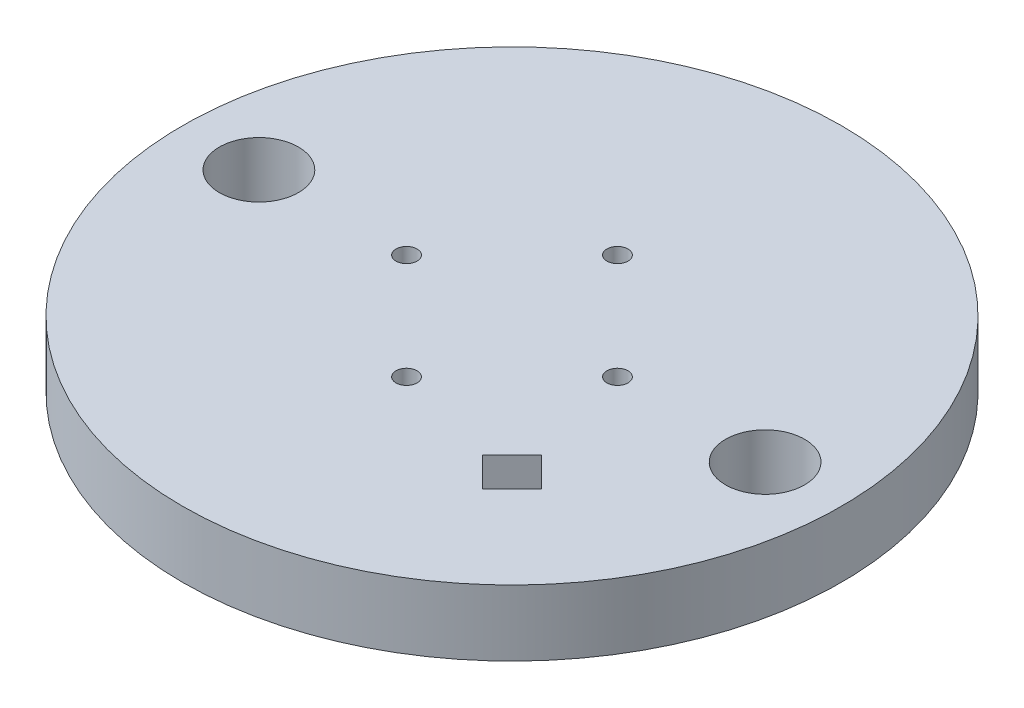
ISO-10303-21;
HEADER;
FILE_DESCRIPTION(('STEP AP214'),'2;1');
FILE_NAME('part.step','',(''),(''),'','','');
FILE_SCHEMA(('AUTOMOTIVE_DESIGN { 1 0 10303 214 1 1 1 1 }'));
ENDSEC;
DATA;
#1=APPLICATION_CONTEXT('core data for automotive mechanical design processes');
#2=APPLICATION_PROTOCOL_DEFINITION('international standard','automotive_design',2000,#1);
#3=PRODUCT_CONTEXT('',#1,'mechanical');
#4=PRODUCT('Part','Part','',(#3));
#5=PRODUCT_RELATED_PRODUCT_CATEGORY('part','',(#4));
#6=PRODUCT_DEFINITION_FORMATION('','',#4);
#7=PRODUCT_DEFINITION_CONTEXT('part definition',#1,'design');
#8=PRODUCT_DEFINITION('design','',#6,#7);
#9=PRODUCT_DEFINITION_SHAPE('','',#8);
#10=(LENGTH_UNIT() NAMED_UNIT(*) SI_UNIT(.MILLI.,.METRE.));
#11=(NAMED_UNIT(*) PLANE_ANGLE_UNIT() SI_UNIT($,.RADIAN.));
#12=(NAMED_UNIT(*) SI_UNIT($,.STERADIAN.) SOLID_ANGLE_UNIT());
#13=UNCERTAINTY_MEASURE_WITH_UNIT(LENGTH_MEASURE(1.E-05),#10,'distance_accuracy_value','');
#14=(GEOMETRIC_REPRESENTATION_CONTEXT(3) GLOBAL_UNCERTAINTY_ASSIGNED_CONTEXT((#13)) GLOBAL_UNIT_ASSIGNED_CONTEXT((#10,
#11,#12)) REPRESENTATION_CONTEXT('',''));
#15=CARTESIAN_POINT('',(0.,0.,0.));
#16=DIRECTION('',(0.,0.,1.));
#17=DIRECTION('',(1.,0.,0.));
#18=AXIS2_PLACEMENT_3D('',#15,#16,#17);
#19=CARTESIAN_POINT('',(0.,1.5875,0.));
#20=DIRECTION('',(0.,1.,0.));
#21=DIRECTION('',(0.,0.,1.));
#22=AXIS2_PLACEMENT_3D('',#19,#20,#21);
#23=PLANE('',#22);
#24=CARTESIAN_POINT('',(2.54,1.5875,0.));
#25=DIRECTION('',(0.,1.,0.));
#26=DIRECTION('',(0.,0.,1.));
#27=AXIS2_PLACEMENT_3D('',#24,#25,#26);
#28=CIRCLE('',#27,0.254);
#29=CARTESIAN_POINT('',(2.54,1.5875,0.254));
#30=VERTEX_POINT('',#29);
#31=EDGE_CURVE('E112',#30,#30,#28,.T.);
#32=ORIENTED_EDGE('',*,*,#31,.F.);
#33=EDGE_LOOP('',(#32));
#34=FACE_BOUND('',#33,.T.);
#35=CARTESIAN_POINT('',(-2.54,1.5875,0.));
#36=DIRECTION('',(0.,1.,0.));
#37=DIRECTION('',(0.,0.,1.));
#38=AXIS2_PLACEMENT_3D('',#35,#36,#37);
#39=CIRCLE('',#38,0.254);
#40=CARTESIAN_POINT('',(-2.54,1.5875,0.254));
#41=VERTEX_POINT('',#40);
#42=EDGE_CURVE('E124',#41,#41,#39,.T.);
#43=ORIENTED_EDGE('',*,*,#42,.F.);
#44=EDGE_LOOP('',(#43));
#45=FACE_BOUND('',#44,.T.);
#46=CARTESIAN_POINT('',(6.096,1.5875,0.));
#47=DIRECTION('',(0.,1.,0.));
#48=DIRECTION('',(0.,0.,1.));
#49=AXIS2_PLACEMENT_3D('',#46,#47,#48);
#50=CIRCLE('',#49,0.9525);
#51=CARTESIAN_POINT('',(6.096,1.5875,0.9525));
#52=VERTEX_POINT('',#51);
#53=EDGE_CURVE('E136',#52,#52,#50,.T.);
#54=ORIENTED_EDGE('',*,*,#53,.F.);
#55=EDGE_LOOP('',(#54));
#56=FACE_BOUND('',#55,.T.);
#57=CARTESIAN_POINT('',(0.,1.5875,0.));
#58=DIRECTION('',(0.,1.,0.));
#59=DIRECTION('',(0.,0.,1.));
#60=AXIS2_PLACEMENT_3D('',#57,#58,#59);
#61=CIRCLE('',#60,7.9375);
#62=CARTESIAN_POINT('',(0.,1.5875,7.9375));
#63=VERTEX_POINT('',#62);
#64=EDGE_CURVE('E11',#63,#63,#61,.T.);
#65=ORIENTED_EDGE('',*,*,#64,.T.);
#66=EDGE_LOOP('',(#65));
#67=FACE_BOUND('',#66,.T.);
#68=CARTESIAN_POINT('',(-6.096,1.5875,0.));
#69=DIRECTION('',(0.,1.,0.));
#70=DIRECTION('',(0.,0.,1.));
#71=AXIS2_PLACEMENT_3D('',#68,#69,#70);
#72=CIRCLE('',#71,0.9525);
#73=CARTESIAN_POINT('',(-6.096,1.5875,0.9525));
#74=VERTEX_POINT('',#73);
#75=EDGE_CURVE('E142',#74,#74,#72,.T.);
#76=ORIENTED_EDGE('',*,*,#75,.F.);
#77=EDGE_LOOP('',(#76));
#78=FACE_BOUND('',#77,.T.);
#79=CARTESIAN_POINT('',(0.,1.5875,-2.54));
#80=DIRECTION('',(0.,1.,0.));
#81=DIRECTION('',(0.,0.,1.));
#82=AXIS2_PLACEMENT_3D('',#79,#80,#81);
#83=CIRCLE('',#82,0.254);
#84=CARTESIAN_POINT('',(0.,1.5875,-2.286));
#85=VERTEX_POINT('',#84);
#86=EDGE_CURVE('E130',#85,#85,#83,.T.);
#87=ORIENTED_EDGE('',*,*,#86,.F.);
#88=EDGE_LOOP('',(#87));
#89=FACE_BOUND('',#88,.T.);
#90=CARTESIAN_POINT('',(0.,1.5875,2.54));
#91=DIRECTION('',(0.,1.,0.));
#92=DIRECTION('',(0.,0.,1.));
#93=AXIS2_PLACEMENT_3D('',#90,#91,#92);
#94=CIRCLE('',#93,0.254);
#95=CARTESIAN_POINT('',(0.,1.5875,2.794));
#96=VERTEX_POINT('',#95);
#97=EDGE_CURVE('E118',#96,#96,#94,.T.);
#98=ORIENTED_EDGE('',*,*,#97,.F.);
#99=EDGE_LOOP('',(#98));
#100=FACE_BOUND('',#99,.T.);
#101=DIRECTION('',(0.707106781186546,0.,0.707106781186549));
#102=VECTOR('',#101,1.);
#103=CARTESIAN_POINT('',(2.54558441227156,1.5875,3.25269119345812));
#104=LINE('',#103,#102);
#105=CARTESIAN_POINT('',(2.54558441227156,1.5875,3.25269119345812));
#106=VERTEX_POINT('',#105);
#107=CARTESIAN_POINT('',(3.25269119345811,1.5875,3.95979797464467));
#108=VERTEX_POINT('',#107);
#109=EDGE_CURVE('E84',#106,#108,#104,.T.);
#110=ORIENTED_EDGE('',*,*,#109,.F.);
#111=DIRECTION('',(-0.707106781186549,0.,0.707106781186546));
#112=VECTOR('',#111,1.);
#113=CARTESIAN_POINT('',(3.25269119345811,1.5875,2.54558441227158));
#114=LINE('',#113,#112);
#115=CARTESIAN_POINT('',(3.25269119345811,1.5875,2.54558441227158));
#116=VERTEX_POINT('',#115);
#117=EDGE_CURVE('E76',#116,#106,#114,.T.);
#118=ORIENTED_EDGE('',*,*,#117,.F.);
#119=DIRECTION('',(-0.707106781186547,0.,-0.707106781186548));
#120=VECTOR('',#119,1.);
#121=CARTESIAN_POINT('',(3.25269119345811,1.5875,2.54558441227158));
#122=LINE('',#121,#120);
#123=CARTESIAN_POINT('',(3.95979797464466,1.5875,3.25269119345812));
#124=VERTEX_POINT('',#123);
#125=EDGE_CURVE('E98',#124,#116,#122,.T.);
#126=ORIENTED_EDGE('',*,*,#125,.F.);
#127=DIRECTION('',(0.707106781186549,0.,-0.707106781186546));
#128=VECTOR('',#127,1.);
#129=CARTESIAN_POINT('',(3.95979797464466,1.5875,3.25269119345812));
#130=LINE('',#129,#128);
#131=EDGE_CURVE('E96',#108,#124,#130,.T.);
#132=ORIENTED_EDGE('',*,*,#131,.F.);
#133=EDGE_LOOP('',(#110,#118,#126,#132));
#134=FACE_BOUND('',#133,.T.);
#135=ADVANCED_FACE('F35',(#34,#45,#56,#67,#78,#89,#100,#134),#23,.T.);
#136=CARTESIAN_POINT('',(0.,0.,0.));
#137=DIRECTION('',(0.,1.,0.));
#138=DIRECTION('',(0.,0.,1.));
#139=AXIS2_PLACEMENT_3D('',#136,#137,#138);
#140=PLANE('',#139);
#141=CARTESIAN_POINT('',(2.54,0.,0.));
#142=DIRECTION('',(0.,1.,0.));
#143=DIRECTION('',(0.,0.,1.));
#144=AXIS2_PLACEMENT_3D('',#141,#142,#143);
#145=CIRCLE('',#144,0.254);
#146=CARTESIAN_POINT('',(2.54,0.,0.254));
#147=VERTEX_POINT('',#146);
#148=EDGE_CURVE('E92',#147,#147,#145,.T.);
#149=ORIENTED_EDGE('',*,*,#148,.T.);
#150=EDGE_LOOP('',(#149));
#151=FACE_BOUND('',#150,.T.);
#152=CARTESIAN_POINT('',(-2.54,0.,0.));
#153=DIRECTION('',(0.,1.,0.));
#154=DIRECTION('',(0.,0.,1.));
#155=AXIS2_PLACEMENT_3D('',#152,#153,#154);
#156=CIRCLE('',#155,0.254);
#157=CARTESIAN_POINT('',(-2.54,0.,0.254));
#158=VERTEX_POINT('',#157);
#159=EDGE_CURVE('E121',#158,#158,#156,.T.);
#160=ORIENTED_EDGE('',*,*,#159,.T.);
#161=EDGE_LOOP('',(#160));
#162=FACE_BOUND('',#161,.T.);
#163=CARTESIAN_POINT('',(6.096,0.,0.));
#164=DIRECTION('',(0.,1.,0.));
#165=DIRECTION('',(0.,0.,1.));
#166=AXIS2_PLACEMENT_3D('',#163,#164,#165);
#167=CIRCLE('',#166,0.9525);
#168=CARTESIAN_POINT('',(6.096,0.,0.9525));
#169=VERTEX_POINT('',#168);
#170=EDGE_CURVE('E133',#169,#169,#167,.T.);
#171=ORIENTED_EDGE('',*,*,#170,.T.);
#172=EDGE_LOOP('',(#171));
#173=FACE_BOUND('',#172,.T.);
#174=CARTESIAN_POINT('',(0.,0.,0.));
#175=DIRECTION('',(0.,1.,0.));
#176=DIRECTION('',(0.,0.,1.));
#177=AXIS2_PLACEMENT_3D('',#174,#175,#176);
#178=CIRCLE('',#177,7.9375);
#179=CARTESIAN_POINT('',(0.,0.,7.9375));
#180=VERTEX_POINT('',#179);
#181=EDGE_CURVE('E39',#180,#180,#178,.T.);
#182=ORIENTED_EDGE('',*,*,#181,.F.);
#183=EDGE_LOOP('',(#182));
#184=FACE_BOUND('',#183,.T.);
#185=CARTESIAN_POINT('',(-6.096,0.,0.));
#186=DIRECTION('',(0.,1.,0.));
#187=DIRECTION('',(0.,0.,1.));
#188=AXIS2_PLACEMENT_3D('',#185,#186,#187);
#189=CIRCLE('',#188,0.9525);
#190=CARTESIAN_POINT('',(-6.096,0.,0.9525));
#191=VERTEX_POINT('',#190);
#192=EDGE_CURVE('E139',#191,#191,#189,.T.);
#193=ORIENTED_EDGE('',*,*,#192,.T.);
#194=EDGE_LOOP('',(#193));
#195=FACE_BOUND('',#194,.T.);
#196=CARTESIAN_POINT('',(0.,0.,-2.54));
#197=DIRECTION('',(0.,1.,0.));
#198=DIRECTION('',(0.,0.,1.));
#199=AXIS2_PLACEMENT_3D('',#196,#197,#198);
#200=CIRCLE('',#199,0.254);
#201=CARTESIAN_POINT('',(0.,0.,-2.286));
#202=VERTEX_POINT('',#201);
#203=EDGE_CURVE('E127',#202,#202,#200,.T.);
#204=ORIENTED_EDGE('',*,*,#203,.T.);
#205=EDGE_LOOP('',(#204));
#206=FACE_BOUND('',#205,.T.);
#207=CARTESIAN_POINT('',(0.,0.,2.54));
#208=DIRECTION('',(0.,1.,0.));
#209=DIRECTION('',(0.,0.,1.));
#210=AXIS2_PLACEMENT_3D('',#207,#208,#209);
#211=CIRCLE('',#210,0.254);
#212=CARTESIAN_POINT('',(0.,0.,2.794));
#213=VERTEX_POINT('',#212);
#214=EDGE_CURVE('E115',#213,#213,#211,.T.);
#215=ORIENTED_EDGE('',*,*,#214,.T.);
#216=EDGE_LOOP('',(#215));
#217=FACE_BOUND('',#216,.T.);
#218=DIRECTION('',(-0.707106781186549,0.,0.707106781186546));
#219=VECTOR('',#218,1.);
#220=CARTESIAN_POINT('',(3.25269119345811,0.,2.54558441227158));
#221=LINE('',#220,#219);
#222=CARTESIAN_POINT('',(3.25269119345811,0.,2.54558441227158));
#223=VERTEX_POINT('',#222);
#224=CARTESIAN_POINT('',(2.54558441227156,0.,3.25269119345812));
#225=VERTEX_POINT('',#224);
#226=EDGE_CURVE('E58',#223,#225,#221,.T.);
#227=ORIENTED_EDGE('',*,*,#226,.T.);
#228=DIRECTION('',(0.707106781186546,0.,0.707106781186549));
#229=VECTOR('',#228,1.);
#230=CARTESIAN_POINT('',(2.54558441227156,0.,3.25269119345812));
#231=LINE('',#230,#229);
#232=CARTESIAN_POINT('',(3.25269119345811,0.,3.95979797464467));
#233=VERTEX_POINT('',#232);
#234=EDGE_CURVE('E91',#225,#233,#231,.T.);
#235=ORIENTED_EDGE('',*,*,#234,.T.);
#236=DIRECTION('',(0.707106781186549,0.,-0.707106781186546));
#237=VECTOR('',#236,1.);
#238=CARTESIAN_POINT('',(3.95979797464466,0.,3.25269119345812));
#239=LINE('',#238,#237);
#240=CARTESIAN_POINT('',(3.95979797464466,0.,3.25269119345812));
#241=VERTEX_POINT('',#240);
#242=EDGE_CURVE('E104',#233,#241,#239,.T.);
#243=ORIENTED_EDGE('',*,*,#242,.T.);
#244=DIRECTION('',(-0.707106781186547,0.,-0.707106781186548));
#245=VECTOR('',#244,1.);
#246=CARTESIAN_POINT('',(3.25269119345811,0.,2.54558441227158));
#247=LINE('',#246,#245);
#248=EDGE_CURVE('E85',#241,#223,#247,.T.);
#249=ORIENTED_EDGE('',*,*,#248,.T.);
#250=EDGE_LOOP('',(#227,#235,#243,#249));
#251=FACE_BOUND('',#250,.T.);
#252=ADVANCED_FACE('F148',(#151,#162,#173,#184,#195,#206,#217,#251),#140,.F.);
#253=CARTESIAN_POINT('',(0.,1.5875,0.));
#254=DIRECTION('',(0.,-1.,0.));
#255=DIRECTION('',(0.,0.,-1.));
#256=AXIS2_PLACEMENT_3D('',#253,#254,#255);
#257=CYLINDRICAL_SURFACE('',#256,7.9375);
#258=ORIENTED_EDGE('',*,*,#64,.F.);
#259=EDGE_LOOP('',(#258));
#260=FACE_BOUND('',#259,.T.);
#261=ORIENTED_EDGE('',*,*,#181,.T.);
#262=EDGE_LOOP('',(#261));
#263=FACE_BOUND('',#262,.T.);
#264=ADVANCED_FACE('F37',(#260,#263),#257,.T.);
#265=CARTESIAN_POINT('',(-6.096,1.5875,0.));
#266=DIRECTION('',(0.,-1.,0.));
#267=DIRECTION('',(0.,0.,-1.));
#268=AXIS2_PLACEMENT_3D('',#265,#266,#267);
#269=CYLINDRICAL_SURFACE('',#268,0.9525);
#270=ORIENTED_EDGE('',*,*,#75,.T.);
#271=EDGE_LOOP('',(#270));
#272=FACE_BOUND('',#271,.T.);
#273=ORIENTED_EDGE('',*,*,#192,.F.);
#274=EDGE_LOOP('',(#273));
#275=FACE_BOUND('',#274,.T.);
#276=ADVANCED_FACE('F151',(#272,#275),#269,.F.);
#277=CARTESIAN_POINT('',(6.096,1.5875,0.));
#278=DIRECTION('',(0.,-1.,0.));
#279=DIRECTION('',(0.,0.,-1.));
#280=AXIS2_PLACEMENT_3D('',#277,#278,#279);
#281=CYLINDRICAL_SURFACE('',#280,0.9525);
#282=ORIENTED_EDGE('',*,*,#53,.T.);
#283=EDGE_LOOP('',(#282));
#284=FACE_BOUND('',#283,.T.);
#285=ORIENTED_EDGE('',*,*,#170,.F.);
#286=EDGE_LOOP('',(#285));
#287=FACE_BOUND('',#286,.T.);
#288=ADVANCED_FACE('F153',(#284,#287),#281,.F.);
#289=CARTESIAN_POINT('',(0.,1.5875,-2.54));
#290=DIRECTION('',(0.,-1.,0.));
#291=DIRECTION('',(0.,0.,-1.));
#292=AXIS2_PLACEMENT_3D('',#289,#290,#291);
#293=CYLINDRICAL_SURFACE('',#292,0.254);
#294=ORIENTED_EDGE('',*,*,#86,.T.);
#295=EDGE_LOOP('',(#294));
#296=FACE_BOUND('',#295,.T.);
#297=ORIENTED_EDGE('',*,*,#203,.F.);
#298=EDGE_LOOP('',(#297));
#299=FACE_BOUND('',#298,.T.);
#300=ADVANCED_FACE('F160',(#296,#299),#293,.F.);
#301=CARTESIAN_POINT('',(-2.54,1.5875,0.));
#302=DIRECTION('',(0.,-1.,0.));
#303=DIRECTION('',(0.,0.,-1.));
#304=AXIS2_PLACEMENT_3D('',#301,#302,#303);
#305=CYLINDRICAL_SURFACE('',#304,0.254);
#306=ORIENTED_EDGE('',*,*,#42,.T.);
#307=EDGE_LOOP('',(#306));
#308=FACE_BOUND('',#307,.T.);
#309=ORIENTED_EDGE('',*,*,#159,.F.);
#310=EDGE_LOOP('',(#309));
#311=FACE_BOUND('',#310,.T.);
#312=ADVANCED_FACE('F189',(#308,#311),#305,.F.);
#313=CARTESIAN_POINT('',(0.,1.5875,2.54));
#314=DIRECTION('',(0.,-1.,0.));
#315=DIRECTION('',(0.,0.,-1.));
#316=AXIS2_PLACEMENT_3D('',#313,#314,#315);
#317=CYLINDRICAL_SURFACE('',#316,0.254);
#318=ORIENTED_EDGE('',*,*,#97,.T.);
#319=EDGE_LOOP('',(#318));
#320=FACE_BOUND('',#319,.T.);
#321=ORIENTED_EDGE('',*,*,#214,.F.);
#322=EDGE_LOOP('',(#321));
#323=FACE_BOUND('',#322,.T.);
#324=ADVANCED_FACE('F185',(#320,#323),#317,.F.);
#325=CARTESIAN_POINT('',(2.54,1.5875,0.));
#326=DIRECTION('',(0.,-1.,0.));
#327=DIRECTION('',(0.,0.,-1.));
#328=AXIS2_PLACEMENT_3D('',#325,#326,#327);
#329=CYLINDRICAL_SURFACE('',#328,0.254);
#330=ORIENTED_EDGE('',*,*,#31,.T.);
#331=EDGE_LOOP('',(#330));
#332=FACE_BOUND('',#331,.T.);
#333=ORIENTED_EDGE('',*,*,#148,.F.);
#334=EDGE_LOOP('',(#333));
#335=FACE_BOUND('',#334,.T.);
#336=ADVANCED_FACE('F188',(#332,#335),#329,.F.);
#337=CARTESIAN_POINT('',(3.25269119345811,1.5875,2.54558441227158));
#338=DIRECTION('',(0.707106781186546,0.,0.707106781186549));
#339=DIRECTION('',(0.707106781186549,0.,-0.707106781186546));
#340=AXIS2_PLACEMENT_3D('',#337,#338,#339);
#341=PLANE('',#340);
#342=ORIENTED_EDGE('',*,*,#226,.F.);
#343=DIRECTION('',(0.,-1.,0.));
#344=VECTOR('',#343,1.);
#345=CARTESIAN_POINT('',(3.25269119345811,1.5875,2.54558441227158));
#346=LINE('',#345,#344);
#347=EDGE_CURVE('E80',#116,#223,#346,.T.);
#348=ORIENTED_EDGE('',*,*,#347,.F.);
#349=ORIENTED_EDGE('',*,*,#117,.T.);
#350=DIRECTION('',(0.,-1.,0.));
#351=VECTOR('',#350,1.);
#352=CARTESIAN_POINT('',(2.54558441227156,1.5875,3.25269119345812));
#353=LINE('',#352,#351);
#354=EDGE_CURVE('E79',#106,#225,#353,.T.);
#355=ORIENTED_EDGE('',*,*,#354,.T.);
#356=EDGE_LOOP('',(#342,#348,#349,#355));
#357=FACE_BOUND('',#356,.T.);
#358=ADVANCED_FACE('F78',(#357),#341,.T.);
#359=CARTESIAN_POINT('',(2.54558441227156,1.5875,3.25269119345812));
#360=DIRECTION('',(0.707106781186549,0.,-0.707106781186546));
#361=DIRECTION('',(-0.707106781186546,0.,-0.707106781186549));
#362=AXIS2_PLACEMENT_3D('',#359,#360,#361);
#363=PLANE('',#362);
#364=ORIENTED_EDGE('',*,*,#234,.F.);
#365=ORIENTED_EDGE('',*,*,#354,.F.);
#366=ORIENTED_EDGE('',*,*,#109,.T.);
#367=DIRECTION('',(0.,-1.,0.));
#368=VECTOR('',#367,1.);
#369=CARTESIAN_POINT('',(3.25269119345811,1.5875,3.95979797464467));
#370=LINE('',#369,#368);
#371=EDGE_CURVE('E93',#108,#233,#370,.T.);
#372=ORIENTED_EDGE('',*,*,#371,.T.);
#373=EDGE_LOOP('',(#364,#365,#366,#372));
#374=FACE_BOUND('',#373,.T.);
#375=ADVANCED_FACE('F88',(#374),#363,.T.);
#376=CARTESIAN_POINT('',(3.95979797464466,1.5875,3.25269119345812));
#377=DIRECTION('',(-0.707106781186546,0.,-0.707106781186549));
#378=DIRECTION('',(-0.707106781186549,0.,0.707106781186546));
#379=AXIS2_PLACEMENT_3D('',#376,#377,#378);
#380=PLANE('',#379);
#381=ORIENTED_EDGE('',*,*,#242,.F.);
#382=ORIENTED_EDGE('',*,*,#371,.F.);
#383=ORIENTED_EDGE('',*,*,#131,.T.);
#384=DIRECTION('',(0.,-1.,0.));
#385=VECTOR('',#384,1.);
#386=CARTESIAN_POINT('',(3.95979797464466,1.5875,3.25269119345812));
#387=LINE('',#386,#385);
#388=EDGE_CURVE('E50',#124,#241,#387,.T.);
#389=ORIENTED_EDGE('',*,*,#388,.T.);
#390=EDGE_LOOP('',(#381,#382,#383,#389));
#391=FACE_BOUND('',#390,.T.);
#392=ADVANCED_FACE('F197',(#391),#380,.T.);
#393=CARTESIAN_POINT('',(3.25269119345811,1.5875,2.54558441227158));
#394=DIRECTION('',(-0.707106781186548,0.,0.707106781186547));
#395=DIRECTION('',(0.707106781186547,0.,0.707106781186548));
#396=AXIS2_PLACEMENT_3D('',#393,#394,#395);
#397=PLANE('',#396);
#398=ORIENTED_EDGE('',*,*,#248,.F.);
#399=ORIENTED_EDGE('',*,*,#388,.F.);
#400=ORIENTED_EDGE('',*,*,#125,.T.);
#401=ORIENTED_EDGE('',*,*,#347,.T.);
#402=EDGE_LOOP('',(#398,#399,#400,#401));
#403=FACE_BOUND('',#402,.T.);
#404=ADVANCED_FACE('F195',(#403),#397,.T.);
#405=CLOSED_SHELL('',(#135,#252,#264,#276,#288,#300,#312,#324,#336,#358,#375,#392,#404));
#406=MANIFOLD_SOLID_BREP('B2',#405);
#407=ADVANCED_BREP_SHAPE_REPRESENTATION('',(#18,#406),#14);
#408=SHAPE_DEFINITION_REPRESENTATION(#9,#407);
ENDSEC;
END-ISO-10303-21;
